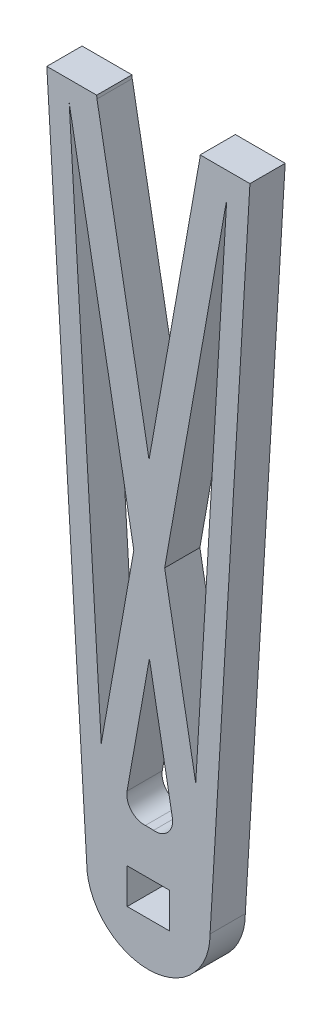
ISO-10303-21;
HEADER;
FILE_DESCRIPTION(('STEP AP214'),'2;1');
FILE_NAME('part.step','',(''),(''),'','','');
FILE_SCHEMA(('AUTOMOTIVE_DESIGN { 1 0 10303 214 1 1 1 1 }'));
ENDSEC;
DATA;
#1=APPLICATION_CONTEXT('core data for automotive mechanical design processes');
#2=APPLICATION_PROTOCOL_DEFINITION('international standard','automotive_design',2000,#1);
#3=PRODUCT_CONTEXT('',#1,'mechanical');
#4=PRODUCT('Part','Part','',(#3));
#5=PRODUCT_RELATED_PRODUCT_CATEGORY('part','',(#4));
#6=PRODUCT_DEFINITION_FORMATION('','',#4);
#7=PRODUCT_DEFINITION_CONTEXT('part definition',#1,'design');
#8=PRODUCT_DEFINITION('design','',#6,#7);
#9=PRODUCT_DEFINITION_SHAPE('','',#8);
#10=(LENGTH_UNIT() NAMED_UNIT(*) SI_UNIT(.MILLI.,.METRE.));
#11=(NAMED_UNIT(*) PLANE_ANGLE_UNIT() SI_UNIT($,.RADIAN.));
#12=(NAMED_UNIT(*) SI_UNIT($,.STERADIAN.) SOLID_ANGLE_UNIT());
#13=UNCERTAINTY_MEASURE_WITH_UNIT(LENGTH_MEASURE(1.E-05),#10,'distance_accuracy_value','');
#14=(GEOMETRIC_REPRESENTATION_CONTEXT(3) GLOBAL_UNCERTAINTY_ASSIGNED_CONTEXT((#13)) GLOBAL_UNIT_ASSIGNED_CONTEXT((#10,
#11,#12)) REPRESENTATION_CONTEXT('',''));
#15=CARTESIAN_POINT('',(0.,0.,0.));
#16=DIRECTION('',(0.,0.,1.));
#17=DIRECTION('',(1.,0.,0.));
#18=AXIS2_PLACEMENT_3D('',#15,#16,#17);
#19=CARTESIAN_POINT('',(0.,0.,10.));
#20=DIRECTION('',(0.,0.,1.));
#21=DIRECTION('',(1.,0.,0.));
#22=AXIS2_PLACEMENT_3D('',#19,#20,#21);
#23=PLANE('',#22);
#24=DIRECTION('',(1.,0.,0.));
#25=VECTOR('',#24,1.);
#26=CARTESIAN_POINT('',(28.8095238095238,-20.,10.));
#27=LINE('',#26,#25);
#28=CARTESIAN_POINT('',(-28.8095238095238,-20.,10.));
#29=VERTEX_POINT('',#28);
#30=CARTESIAN_POINT('',(-14.6611012369298,-20.,10.));
#31=VERTEX_POINT('',#30);
#32=EDGE_CURVE('E122',#29,#31,#27,.T.);
#33=ORIENTED_EDGE('',*,*,#32,.F.);
#34=DIRECTION('',(0.0594186399842153,-0.998233151734817,0.));
#35=VECTOR('',#34,1.);
#36=CARTESIAN_POINT('',(-29.8940827566728,-1.77940968789719,10.));
#37=LINE('',#36,#35);
#38=CARTESIAN_POINT('',(-17.5,-210.,10.));
#39=VERTEX_POINT('',#38);
#40=EDGE_CURVE('E282',#29,#39,#37,.T.);
#41=ORIENTED_EDGE('',*,*,#40,.T.);
#42=CARTESIAN_POINT('',(0.,-210.,10.));
#43=DIRECTION('',(0.,0.,1.));
#44=DIRECTION('',(1.,0.,0.));
#45=AXIS2_PLACEMENT_3D('',#42,#43,#44);
#46=CIRCLE('',#45,17.5);
#47=CARTESIAN_POINT('',(17.5,-210.,10.));
#48=VERTEX_POINT('',#47);
#49=EDGE_CURVE('E291',#39,#48,#46,.T.);
#50=ORIENTED_EDGE('',*,*,#49,.T.);
#51=DIRECTION('',(-0.0594186399842153,-0.998233151734817,0.));
#52=VECTOR('',#51,1.);
#53=CARTESIAN_POINT('',(29.8940827566728,-1.77940968789719,10.));
#54=LINE('',#53,#52);
#55=CARTESIAN_POINT('',(28.8095238095238,-20.,10.));
#56=VERTEX_POINT('',#55);
#57=EDGE_CURVE('E294',#56,#48,#54,.T.);
#58=ORIENTED_EDGE('',*,*,#57,.F.);
#59=DIRECTION('',(-1.,0.,0.));
#60=VECTOR('',#59,1.);
#61=CARTESIAN_POINT('',(0.,-20.,10.));
#62=LINE('',#61,#60);
#63=CARTESIAN_POINT('',(14.6791588769717,-20.,10.));
#64=VERTEX_POINT('',#63);
#65=EDGE_CURVE('E275',#56,#64,#62,.T.);
#66=ORIENTED_EDGE('',*,*,#65,.T.);
#67=CARTESIAN_POINT('',(9.67915887697167,-20.,10.));
#68=DIRECTION('',(0.,0.,1.));
#69=DIRECTION('',(1.,0.,0.));
#70=AXIS2_PLACEMENT_3D('',#67,#68,#69);
#71=CIRCLE('',#70,5.);
#72=CARTESIAN_POINT('',(14.6023785703389,-20.8728733303528,10.));
#73=VERTEX_POINT('',#72);
#74=EDGE_CURVE('E115',#64,#73,#71,.F.);
#75=ORIENTED_EDGE('',*,*,#74,.T.);
#76=DIRECTION('',(0.174574666070561,0.984643938673444,0.));
#77=VECTOR('',#76,1.);
#78=CARTESIAN_POINT('',(17.7452712206691,-3.14618785126878,10.));
#79=LINE('',#78,#77);
#80=CARTESIAN_POINT('',(0.190220551076297,-102.160979768059,10.));
#81=VERTEX_POINT('',#80);
#82=EDGE_CURVE('E369',#81,#73,#79,.T.);
#83=ORIENTED_EDGE('',*,*,#82,.F.);
#84=DIRECTION('',(-0.178826073356073,0.983880701857724,0.));
#85=VECTOR('',#84,1.);
#86=CARTESIAN_POINT('',(-17.7904251161172,-3.23351384049256,10.));
#87=LINE('',#86,#85);
#88=CARTESIAN_POINT('',(-14.5805047462184,-20.8941303667804,10.));
#89=VERTEX_POINT('',#88);
#90=EDGE_CURVE('E377',#81,#89,#87,.T.);
#91=ORIENTED_EDGE('',*,*,#90,.T.);
#92=CARTESIAN_POINT('',(-9.66110123692979,-20.,10.));
#93=DIRECTION('',(0.,0.,1.));
#94=DIRECTION('',(1.,0.,0.));
#95=AXIS2_PLACEMENT_3D('',#92,#93,#94);
#96=CIRCLE('',#95,5.);
#97=EDGE_CURVE('E285',#89,#31,#96,.F.);
#98=ORIENTED_EDGE('',*,*,#97,.T.);
#99=EDGE_LOOP('',(#33,#41,#50,#58,#66,#75,#83,#91,#98));
#100=FACE_BOUND('',#99,.T.);
#101=DIRECTION('',(0.,1.,0.));
#102=VECTOR('',#101,1.);
#103=CARTESIAN_POINT('',(-6.00000000000001,0.,10.));
#104=LINE('',#103,#102);
#105=CARTESIAN_POINT('',(-6.00000000000001,-215.,10.));
#106=VERTEX_POINT('',#105);
#107=CARTESIAN_POINT('',(-6.00000000000001,-205.,10.));
#108=VERTEX_POINT('',#107);
#109=EDGE_CURVE('E304',#106,#108,#104,.T.);
#110=ORIENTED_EDGE('',*,*,#109,.T.);
#111=DIRECTION('',(1.,0.,0.));
#112=VECTOR('',#111,1.);
#113=CARTESIAN_POINT('',(4.74157750100327E-13,-205.,10.));
#114=LINE('',#113,#112);
#115=CARTESIAN_POINT('',(6.,-205.,10.));
#116=VERTEX_POINT('',#115);
#117=EDGE_CURVE('E307',#108,#116,#114,.T.);
#118=ORIENTED_EDGE('',*,*,#117,.T.);
#119=DIRECTION('',(0.,1.,0.));
#120=VECTOR('',#119,1.);
#121=CARTESIAN_POINT('',(5.99999999999989,0.,10.));
#122=LINE('',#121,#120);
#123=CARTESIAN_POINT('',(6.00000000000001,-215.,10.));
#124=VERTEX_POINT('',#123);
#125=EDGE_CURVE('E309',#124,#116,#122,.T.);
#126=ORIENTED_EDGE('',*,*,#125,.F.);
#127=DIRECTION('',(1.,0.,0.));
#128=VECTOR('',#127,1.);
#129=CARTESIAN_POINT('',(-4.97287396446684E-13,-215.,10.));
#130=LINE('',#129,#128);
#131=EDGE_CURVE('E312',#106,#124,#130,.T.);
#132=ORIENTED_EDGE('',*,*,#131,.F.);
#133=EDGE_LOOP('',(#110,#118,#126,#132));
#134=FACE_BOUND('',#133,.T.);
#135=DIRECTION('',(-0.178826073356073,0.983880701857724,0.));
#136=VECTOR('',#135,1.);
#137=CARTESIAN_POINT('',(-26.2678721622271,-4.77433943497515,10.));
#138=LINE('',#137,#136);
#139=CARTESIAN_POINT('',(6.79531038371948,-186.684206595022,10.));
#140=VERTEX_POINT('',#139);
#141=CARTESIAN_POINT('',(0.29160959832128,-150.901585116392,10.));
#142=VERTEX_POINT('',#141);
#143=EDGE_CURVE('E719',#140,#142,#138,.T.);
#144=ORIENTED_EDGE('',*,*,#143,.F.);
#145=CARTESIAN_POINT('',(1.87590687443086,-187.578336961803,10.));
#146=DIRECTION('',(0.,0.,1.));
#147=DIRECTION('',(1.,0.,0.));
#148=AXIS2_PLACEMENT_3D('',#145,#146,#147);
#149=CIRCLE('',#148,5.);
#150=CARTESIAN_POINT('',(1.45903868011289,-192.560928748069,10.));
#151=VERTEX_POINT('',#150);
#152=EDGE_CURVE('E357',#140,#151,#149,.F.);
#153=ORIENTED_EDGE('',*,*,#152,.T.);
#154=CARTESIAN_POINT('',(0.,-210.,10.));
#155=DIRECTION('',(0.,0.,1.));
#156=DIRECTION('',(1.,0.,0.));
#157=AXIS2_PLACEMENT_3D('',#154,#155,#156);
#158=CIRCLE('',#157,17.5);
#159=CARTESIAN_POINT('',(-0.874372767581587,-192.521857299378,10.));
#160=VERTEX_POINT('',#159);
#161=EDGE_CURVE('E714',#151,#160,#158,.T.);
#162=ORIENTED_EDGE('',*,*,#161,.T.);
#163=CARTESIAN_POINT('',(-1.12419355831918,-187.528102242057,10.));
#164=DIRECTION('',(0.,0.,1.));
#165=DIRECTION('',(1.,0.,0.));
#166=AXIS2_PLACEMENT_3D('',#163,#164,#165);
#167=CIRCLE('',#166,5.);
#168=CARTESIAN_POINT('',(-6.0474132516864,-186.655228911704,10.));
#169=VERTEX_POINT('',#168);
#170=EDGE_CURVE('E361',#160,#169,#167,.F.);
#171=ORIENTED_EDGE('',*,*,#170,.T.);
#172=DIRECTION('',(0.174574666070561,0.984643938673444,0.));
#173=VECTOR('',#172,1.);
#174=CARTESIAN_POINT('',(26.2217824014059,-4.64905000346376,10.));
#175=LINE('',#174,#173);
#176=EDGE_CURVE('E727',#169,#142,#175,.T.);
#177=ORIENTED_EDGE('',*,*,#176,.T.);
#178=EDGE_LOOP('',(#144,#153,#162,#171,#177));
#179=FACE_BOUND('',#178,.T.);
#180=DIRECTION('',(-0.178826073356073,0.983880701857724,0.));
#181=VECTOR('',#180,1.);
#182=CARTESIAN_POINT('',(-17.7904251161172,-3.23351384049256,10.));
#183=LINE('',#182,#181);
#184=CARTESIAN_POINT('',(13.4301626709257,-175.005634358752,10.));
#185=VERTEX_POINT('',#184);
#186=CARTESIAN_POINT('',(4.61598635326493,-126.511039476885,10.));
#187=VERTEX_POINT('',#186);
#188=EDGE_CURVE('E420',#185,#187,#183,.T.);
#189=ORIENTED_EDGE('',*,*,#188,.T.);
#190=DIRECTION('',(0.174574666070561,0.984643938673444,0.));
#191=VECTOR('',#190,1.);
#192=CARTESIAN_POINT('',(26.2217824014059,-4.64905000346376,10.));
#193=LINE('',#192,#191);
#194=CARTESIAN_POINT('',(22.2304198411749,-27.1613138985647,10.));
#195=VERTEX_POINT('',#194);
#196=EDGE_CURVE('E417',#187,#195,#193,.T.);
#197=ORIENTED_EDGE('',*,*,#196,.T.);
#198=DIRECTION('',(-0.0594186399842153,-0.998233151734817,0.));
#199=VECTOR('',#198,1.);
#200=CARTESIAN_POINT('',(23.7629705178262,-1.41446253082299,10.));
#201=LINE('',#200,#199);
#202=EDGE_CURVE('E411',#195,#185,#201,.T.);
#203=ORIENTED_EDGE('',*,*,#202,.T.);
#204=EDGE_LOOP('',(#189,#197,#203));
#205=FACE_BOUND('',#204,.T.);
#206=DIRECTION('',(0.174574666070561,0.984643938673444,0.));
#207=VECTOR('',#206,1.);
#208=CARTESIAN_POINT('',(17.7452712206691,-3.14618785126878,10.));
#209=LINE('',#208,#207);
#210=CARTESIAN_POINT('',(-13.367328464566,-178.628881795291,10.));
#211=VERTEX_POINT('',#210);
#212=CARTESIAN_POINT('',(-4.13415620386734,-126.551525407566,10.));
#213=VERTEX_POINT('',#212);
#214=EDGE_CURVE('E745',#211,#213,#209,.T.);
#215=ORIENTED_EDGE('',*,*,#214,.F.);
#216=DIRECTION('',(-0.0594186399842153,0.998233151734817,0.));
#217=VECTOR('',#216,1.);
#218=CARTESIAN_POINT('',(-23.9152662053382,-1.42352775031775,10.));
#219=LINE('',#218,#217);
#220=CARTESIAN_POINT('',(-22.4730270714025,-25.6531452004381,10.));
#221=VERTEX_POINT('',#220);
#222=EDGE_CURVE('E429',#211,#221,#219,.T.);
#223=ORIENTED_EDGE('',*,*,#222,.T.);
#224=DIRECTION('',(-0.178826073356073,0.983880701857724,0.));
#225=VECTOR('',#224,1.);
#226=CARTESIAN_POINT('',(-26.2678721622271,-4.77433943497515,10.));
#227=LINE('',#226,#225);
#228=EDGE_CURVE('E402',#213,#221,#227,.T.);
#229=ORIENTED_EDGE('',*,*,#228,.F.);
#230=EDGE_LOOP('',(#215,#223,#229));
#231=FACE_BOUND('',#230,.T.);
#232=ADVANCED_FACE('F107',(#100,#134,#179,#205,#231),#23,.T.);
#233=CARTESIAN_POINT('',(0.,0.,0.));
#234=DIRECTION('',(0.,0.,1.));
#235=DIRECTION('',(1.,0.,0.));
#236=AXIS2_PLACEMENT_3D('',#233,#234,#235);
#237=PLANE('',#236);
#238=DIRECTION('',(-0.0594186399842153,0.998233151734817,0.));
#239=VECTOR('',#238,1.);
#240=CARTESIAN_POINT('',(-23.9152662053382,-1.42352775031775,0.));
#241=LINE('',#240,#239);
#242=CARTESIAN_POINT('',(-13.367328464566,-178.628881795291,0.));
#243=VERTEX_POINT('',#242);
#244=CARTESIAN_POINT('',(-22.4730270714025,-25.6531452004381,0.));
#245=VERTEX_POINT('',#244);
#246=EDGE_CURVE('E737',#243,#245,#241,.T.);
#247=ORIENTED_EDGE('',*,*,#246,.F.);
#248=DIRECTION('',(0.174574666070561,0.984643938673444,0.));
#249=VECTOR('',#248,1.);
#250=CARTESIAN_POINT('',(17.7452712206691,-3.14618785126878,0.));
#251=LINE('',#250,#249);
#252=CARTESIAN_POINT('',(-4.13415620386734,-126.551525407566,0.));
#253=VERTEX_POINT('',#252);
#254=EDGE_CURVE('E739',#243,#253,#251,.T.);
#255=ORIENTED_EDGE('',*,*,#254,.T.);
#256=DIRECTION('',(-0.178826073356073,0.983880701857724,0.));
#257=VECTOR('',#256,1.);
#258=CARTESIAN_POINT('',(-26.2678721622271,-4.77433943497515,0.));
#259=LINE('',#258,#257);
#260=EDGE_CURVE('E407',#253,#245,#259,.T.);
#261=ORIENTED_EDGE('',*,*,#260,.T.);
#262=EDGE_LOOP('',(#247,#255,#261));
#263=FACE_BOUND('',#262,.T.);
#264=CARTESIAN_POINT('',(0.,-210.,0.));
#265=DIRECTION('',(0.,0.,1.));
#266=DIRECTION('',(1.,0.,0.));
#267=AXIS2_PLACEMENT_3D('',#264,#265,#266);
#268=CIRCLE('',#267,17.5);
#269=CARTESIAN_POINT('',(1.45903868011289,-192.560928748069,0.));
#270=VERTEX_POINT('',#269);
#271=CARTESIAN_POINT('',(-0.874372767581587,-192.521857299378,0.));
#272=VERTEX_POINT('',#271);
#273=EDGE_CURVE('E723',#270,#272,#268,.T.);
#274=ORIENTED_EDGE('',*,*,#273,.F.);
#275=CARTESIAN_POINT('',(1.87590687443086,-187.578336961803,0.));
#276=DIRECTION('',(0.,0.,1.));
#277=DIRECTION('',(1.,0.,0.));
#278=AXIS2_PLACEMENT_3D('',#275,#276,#277);
#279=CIRCLE('',#278,5.);
#280=CARTESIAN_POINT('',(6.79531038371948,-186.684206595022,0.));
#281=VERTEX_POINT('',#280);
#282=EDGE_CURVE('E359',#270,#281,#279,.T.);
#283=ORIENTED_EDGE('',*,*,#282,.T.);
#284=DIRECTION('',(-0.178826073356073,0.983880701857724,0.));
#285=VECTOR('',#284,1.);
#286=CARTESIAN_POINT('',(-26.2678721622271,-4.77433943497515,0.));
#287=LINE('',#286,#285);
#288=CARTESIAN_POINT('',(0.291609598321283,-150.901585116392,0.));
#289=VERTEX_POINT('',#288);
#290=EDGE_CURVE('E726',#281,#289,#287,.T.);
#291=ORIENTED_EDGE('',*,*,#290,.T.);
#292=DIRECTION('',(0.174574666070561,0.984643938673444,0.));
#293=VECTOR('',#292,1.);
#294=CARTESIAN_POINT('',(26.2217824014059,-4.64905000346376,0.));
#295=LINE('',#294,#293);
#296=CARTESIAN_POINT('',(-6.0474132516864,-186.655228911704,0.));
#297=VERTEX_POINT('',#296);
#298=EDGE_CURVE('E730',#297,#289,#295,.T.);
#299=ORIENTED_EDGE('',*,*,#298,.F.);
#300=CARTESIAN_POINT('',(-1.12419355831918,-187.528102242057,0.));
#301=DIRECTION('',(0.,0.,1.));
#302=DIRECTION('',(1.,0.,0.));
#303=AXIS2_PLACEMENT_3D('',#300,#301,#302);
#304=CIRCLE('',#303,5.);
#305=EDGE_CURVE('E363',#297,#272,#304,.T.);
#306=ORIENTED_EDGE('',*,*,#305,.T.);
#307=EDGE_LOOP('',(#274,#283,#291,#299,#306));
#308=FACE_BOUND('',#307,.T.);
#309=DIRECTION('',(0.,1.,0.));
#310=VECTOR('',#309,1.);
#311=CARTESIAN_POINT('',(-6.00000000000001,0.,0.));
#312=LINE('',#311,#310);
#313=CARTESIAN_POINT('',(-6.00000000000001,-215.,0.));
#314=VERTEX_POINT('',#313);
#315=CARTESIAN_POINT('',(-6.00000000000001,-205.,0.));
#316=VERTEX_POINT('',#315);
#317=EDGE_CURVE('E323',#314,#316,#312,.T.);
#318=ORIENTED_EDGE('',*,*,#317,.F.);
#319=DIRECTION('',(1.,0.,0.));
#320=VECTOR('',#319,1.);
#321=CARTESIAN_POINT('',(-4.97287396446684E-13,-215.,0.));
#322=LINE('',#321,#320);
#323=CARTESIAN_POINT('',(6.00000000000001,-215.,0.));
#324=VERTEX_POINT('',#323);
#325=EDGE_CURVE('E292',#314,#324,#322,.T.);
#326=ORIENTED_EDGE('',*,*,#325,.T.);
#327=DIRECTION('',(0.,1.,0.));
#328=VECTOR('',#327,1.);
#329=CARTESIAN_POINT('',(5.99999999999989,0.,0.));
#330=LINE('',#329,#328);
#331=CARTESIAN_POINT('',(6.,-205.,0.));
#332=VERTEX_POINT('',#331);
#333=EDGE_CURVE('E297',#324,#332,#330,.T.);
#334=ORIENTED_EDGE('',*,*,#333,.T.);
#335=DIRECTION('',(1.,0.,0.));
#336=VECTOR('',#335,1.);
#337=CARTESIAN_POINT('',(4.74157750100327E-13,-205.,0.));
#338=LINE('',#337,#336);
#339=EDGE_CURVE('E326',#316,#332,#338,.T.);
#340=ORIENTED_EDGE('',*,*,#339,.F.);
#341=EDGE_LOOP('',(#318,#326,#334,#340));
#342=FACE_BOUND('',#341,.T.);
#343=DIRECTION('',(0.0594186399842153,-0.998233151734817,0.));
#344=VECTOR('',#343,1.);
#345=CARTESIAN_POINT('',(-29.8940827566728,-1.77940968789719,0.));
#346=LINE('',#345,#344);
#347=CARTESIAN_POINT('',(-28.8095238095238,-20.,0.));
#348=VERTEX_POINT('',#347);
#349=CARTESIAN_POINT('',(-17.5,-210.,0.));
#350=VERTEX_POINT('',#349);
#351=EDGE_CURVE('E316',#348,#350,#346,.T.);
#352=ORIENTED_EDGE('',*,*,#351,.F.);
#353=DIRECTION('',(1.,0.,0.));
#354=VECTOR('',#353,1.);
#355=CARTESIAN_POINT('',(28.8095238095238,-20.,0.));
#356=LINE('',#355,#354);
#357=CARTESIAN_POINT('',(-14.6611012369298,-20.,0.));
#358=VERTEX_POINT('',#357);
#359=EDGE_CURVE('E271',#348,#358,#356,.T.);
#360=ORIENTED_EDGE('',*,*,#359,.T.);
#361=CARTESIAN_POINT('',(-9.66110123692979,-20.,0.));
#362=DIRECTION('',(0.,0.,1.));
#363=DIRECTION('',(1.,0.,0.));
#364=AXIS2_PLACEMENT_3D('',#361,#362,#363);
#365=CIRCLE('',#364,5.);
#366=CARTESIAN_POINT('',(-14.5805047462184,-20.8941303667804,0.));
#367=VERTEX_POINT('',#366);
#368=EDGE_CURVE('E366',#358,#367,#365,.T.);
#369=ORIENTED_EDGE('',*,*,#368,.T.);
#370=DIRECTION('',(-0.178826073356073,0.983880701857724,0.));
#371=VECTOR('',#370,1.);
#372=CARTESIAN_POINT('',(-17.7904251161172,-3.23351384049256,0.));
#373=LINE('',#372,#371);
#374=CARTESIAN_POINT('',(0.190220551076304,-102.160979768059,0.));
#375=VERTEX_POINT('',#374);
#376=EDGE_CURVE('E376',#375,#367,#373,.T.);
#377=ORIENTED_EDGE('',*,*,#376,.F.);
#378=DIRECTION('',(0.174574666070561,0.984643938673444,0.));
#379=VECTOR('',#378,1.);
#380=CARTESIAN_POINT('',(17.7452712206691,-3.14618785126878,0.));
#381=LINE('',#380,#379);
#382=CARTESIAN_POINT('',(14.6023785703389,-20.8728733303528,0.));
#383=VERTEX_POINT('',#382);
#384=EDGE_CURVE('E387',#375,#383,#381,.T.);
#385=ORIENTED_EDGE('',*,*,#384,.T.);
#386=CARTESIAN_POINT('',(9.67915887697167,-20.,0.));
#387=DIRECTION('',(0.,0.,1.));
#388=DIRECTION('',(1.,0.,0.));
#389=AXIS2_PLACEMENT_3D('',#386,#387,#388);
#390=CIRCLE('',#389,5.);
#391=CARTESIAN_POINT('',(14.6791588769717,-20.,0.));
#392=VERTEX_POINT('',#391);
#393=EDGE_CURVE('E12',#383,#392,#390,.T.);
#394=ORIENTED_EDGE('',*,*,#393,.T.);
#395=DIRECTION('',(-1.,0.,0.));
#396=VECTOR('',#395,1.);
#397=CARTESIAN_POINT('',(0.,-20.,0.));
#398=LINE('',#397,#396);
#399=CARTESIAN_POINT('',(28.8095238095238,-20.,0.));
#400=VERTEX_POINT('',#399);
#401=EDGE_CURVE('E384',#400,#392,#398,.T.);
#402=ORIENTED_EDGE('',*,*,#401,.F.);
#403=DIRECTION('',(-0.0594186399842153,-0.998233151734817,0.));
#404=VECTOR('',#403,1.);
#405=CARTESIAN_POINT('',(29.8940827566728,-1.77940968789719,0.));
#406=LINE('',#405,#404);
#407=CARTESIAN_POINT('',(17.5,-210.,0.));
#408=VERTEX_POINT('',#407);
#409=EDGE_CURVE('E321',#400,#408,#406,.T.);
#410=ORIENTED_EDGE('',*,*,#409,.T.);
#411=CARTESIAN_POINT('',(0.,-210.,0.));
#412=DIRECTION('',(0.,0.,1.));
#413=DIRECTION('',(1.,0.,0.));
#414=AXIS2_PLACEMENT_3D('',#411,#412,#413);
#415=CIRCLE('',#414,17.5);
#416=EDGE_CURVE('E318',#350,#408,#415,.T.);
#417=ORIENTED_EDGE('',*,*,#416,.F.);
#418=EDGE_LOOP('',(#352,#360,#369,#377,#385,#394,#402,#410,#417));
#419=FACE_BOUND('',#418,.T.);
#420=DIRECTION('',(0.174574666070561,0.984643938673444,0.));
#421=VECTOR('',#420,1.);
#422=CARTESIAN_POINT('',(26.2217824014059,-4.64905000346376,0.));
#423=LINE('',#422,#421);
#424=CARTESIAN_POINT('',(4.61598635326493,-126.511039476885,0.));
#425=VERTEX_POINT('',#424);
#426=CARTESIAN_POINT('',(22.2304198411749,-27.1613138985647,0.));
#427=VERTEX_POINT('',#426);
#428=EDGE_CURVE('E408',#425,#427,#423,.T.);
#429=ORIENTED_EDGE('',*,*,#428,.F.);
#430=DIRECTION('',(-0.178826073356073,0.983880701857724,0.));
#431=VECTOR('',#430,1.);
#432=CARTESIAN_POINT('',(-17.7904251161172,-3.23351384049256,0.));
#433=LINE('',#432,#431);
#434=CARTESIAN_POINT('',(13.4301626709257,-175.005634358752,0.));
#435=VERTEX_POINT('',#434);
#436=EDGE_CURVE('E410',#435,#425,#433,.T.);
#437=ORIENTED_EDGE('',*,*,#436,.F.);
#438=DIRECTION('',(-0.0594186399842153,-0.998233151734817,0.));
#439=VECTOR('',#438,1.);
#440=CARTESIAN_POINT('',(23.7629705178262,-1.41446253082299,0.));
#441=LINE('',#440,#439);
#442=EDGE_CURVE('E413',#427,#435,#441,.T.);
#443=ORIENTED_EDGE('',*,*,#442,.F.);
#444=EDGE_LOOP('',(#429,#437,#443));
#445=FACE_BOUND('',#444,.T.);
#446=ADVANCED_FACE('F382',(#263,#308,#342,#419,#445),#237,.F.);
#447=CARTESIAN_POINT('',(29.8940827566728,-1.77940968789719,10.));
#448=DIRECTION('',(0.998233151734817,-0.0594186399842152,0.));
#449=DIRECTION('',(0.0594186399842152,0.998233151734817,0.));
#450=AXIS2_PLACEMENT_3D('',#447,#448,#449);
#451=PLANE('',#450);
#452=ORIENTED_EDGE('',*,*,#409,.F.);
#453=DIRECTION('',(0.,0.,1.));
#454=VECTOR('',#453,1.);
#455=CARTESIAN_POINT('',(28.8095238095238,-20.,0.));
#456=LINE('',#455,#454);
#457=EDGE_CURVE('E712',#400,#56,#456,.T.);
#458=ORIENTED_EDGE('',*,*,#457,.T.);
#459=ORIENTED_EDGE('',*,*,#57,.T.);
#460=DIRECTION('',(0.,0.,-1.));
#461=VECTOR('',#460,1.);
#462=CARTESIAN_POINT('',(17.5,-210.,10.));
#463=LINE('',#462,#461);
#464=EDGE_CURVE('E315',#48,#408,#463,.T.);
#465=ORIENTED_EDGE('',*,*,#464,.T.);
#466=EDGE_LOOP('',(#452,#458,#459,#465));
#467=FACE_BOUND('',#466,.T.);
#468=ADVANCED_FACE('F447',(#467),#451,.T.);
#469=CARTESIAN_POINT('',(-6.00000000000001,0.,10.));
#470=DIRECTION('',(-1.,0.,0.));
#471=DIRECTION('',(0.,0.,1.));
#472=AXIS2_PLACEMENT_3D('',#469,#470,#471);
#473=PLANE('',#472);
#474=ORIENTED_EDGE('',*,*,#317,.T.);
#475=DIRECTION('',(0.,0.,-1.));
#476=VECTOR('',#475,1.);
#477=CARTESIAN_POINT('',(-6.00000000000001,-205.,10.));
#478=LINE('',#477,#476);
#479=EDGE_CURVE('E337',#108,#316,#478,.T.);
#480=ORIENTED_EDGE('',*,*,#479,.F.);
#481=ORIENTED_EDGE('',*,*,#109,.F.);
#482=DIRECTION('',(0.,0.,-1.));
#483=VECTOR('',#482,1.);
#484=CARTESIAN_POINT('',(-6.00000000000001,-215.,10.));
#485=LINE('',#484,#483);
#486=EDGE_CURVE('E331',#106,#314,#485,.T.);
#487=ORIENTED_EDGE('',*,*,#486,.T.);
#488=EDGE_LOOP('',(#474,#480,#481,#487));
#489=FACE_BOUND('',#488,.T.);
#490=ADVANCED_FACE('F455',(#489),#473,.F.);
#491=CARTESIAN_POINT('',(4.74157750100327E-13,-205.,10.));
#492=DIRECTION('',(0.,1.,0.));
#493=DIRECTION('',(-1.,0.,0.));
#494=AXIS2_PLACEMENT_3D('',#491,#492,#493);
#495=PLANE('',#494);
#496=ORIENTED_EDGE('',*,*,#339,.T.);
#497=DIRECTION('',(0.,0.,-1.));
#498=VECTOR('',#497,1.);
#499=CARTESIAN_POINT('',(6.,-205.,10.));
#500=LINE('',#499,#498);
#501=EDGE_CURVE('E335',#116,#332,#500,.T.);
#502=ORIENTED_EDGE('',*,*,#501,.F.);
#503=ORIENTED_EDGE('',*,*,#117,.F.);
#504=ORIENTED_EDGE('',*,*,#479,.T.);
#505=EDGE_LOOP('',(#496,#502,#503,#504));
#506=FACE_BOUND('',#505,.T.);
#507=ADVANCED_FACE('F472',(#506),#495,.F.);
#508=CARTESIAN_POINT('',(5.99999999999989,0.,10.));
#509=DIRECTION('',(-1.,0.,0.));
#510=DIRECTION('',(0.,-1.,0.));
#511=AXIS2_PLACEMENT_3D('',#508,#509,#510);
#512=PLANE('',#511);
#513=ORIENTED_EDGE('',*,*,#333,.F.);
#514=DIRECTION('',(0.,0.,-1.));
#515=VECTOR('',#514,1.);
#516=CARTESIAN_POINT('',(6.00000000000001,-215.,10.));
#517=LINE('',#516,#515);
#518=EDGE_CURVE('E333',#124,#324,#517,.T.);
#519=ORIENTED_EDGE('',*,*,#518,.F.);
#520=ORIENTED_EDGE('',*,*,#125,.T.);
#521=ORIENTED_EDGE('',*,*,#501,.T.);
#522=EDGE_LOOP('',(#513,#519,#520,#521));
#523=FACE_BOUND('',#522,.T.);
#524=ADVANCED_FACE('F469',(#523),#512,.T.);
#525=CARTESIAN_POINT('',(-29.8940827566728,-1.77940968789719,10.));
#526=DIRECTION('',(0.998233151734817,0.0594186399842152,0.));
#527=DIRECTION('',(-0.0594186399842152,0.998233151734817,0.));
#528=AXIS2_PLACEMENT_3D('',#525,#526,#527);
#529=PLANE('',#528);
#530=ORIENTED_EDGE('',*,*,#40,.F.);
#531=DIRECTION('',(0.,0.,-1.));
#532=VECTOR('',#531,1.);
#533=CARTESIAN_POINT('',(-28.8095238095238,-20.,10.));
#534=LINE('',#533,#532);
#535=EDGE_CURVE('E268',#29,#348,#534,.T.);
#536=ORIENTED_EDGE('',*,*,#535,.T.);
#537=ORIENTED_EDGE('',*,*,#351,.T.);
#538=DIRECTION('',(0.,0.,-1.));
#539=VECTOR('',#538,1.);
#540=CARTESIAN_POINT('',(-17.5,-210.,10.));
#541=LINE('',#540,#539);
#542=EDGE_CURVE('E290',#39,#350,#541,.T.);
#543=ORIENTED_EDGE('',*,*,#542,.F.);
#544=EDGE_LOOP('',(#530,#536,#537,#543));
#545=FACE_BOUND('',#544,.T.);
#546=ADVANCED_FACE('F288',(#545),#529,.F.);
#547=CARTESIAN_POINT('',(0.,-210.,10.));
#548=DIRECTION('',(0.,0.,-1.));
#549=DIRECTION('',(-1.,0.,0.));
#550=AXIS2_PLACEMENT_3D('',#547,#548,#549);
#551=CYLINDRICAL_SURFACE('',#550,17.5);
#552=ORIENTED_EDGE('',*,*,#416,.T.);
#553=ORIENTED_EDGE('',*,*,#464,.F.);
#554=ORIENTED_EDGE('',*,*,#49,.F.);
#555=ORIENTED_EDGE('',*,*,#542,.T.);
#556=EDGE_LOOP('',(#552,#553,#554,#555));
#557=FACE_BOUND('',#556,.T.);
#558=ADVANCED_FACE('F467',(#557),#551,.T.);
#559=CARTESIAN_POINT('',(-4.97287396446684E-13,-215.,10.));
#560=DIRECTION('',(0.,1.,0.));
#561=DIRECTION('',(-1.,0.,0.));
#562=AXIS2_PLACEMENT_3D('',#559,#560,#561);
#563=PLANE('',#562);
#564=ORIENTED_EDGE('',*,*,#325,.F.);
#565=ORIENTED_EDGE('',*,*,#486,.F.);
#566=ORIENTED_EDGE('',*,*,#131,.T.);
#567=ORIENTED_EDGE('',*,*,#518,.T.);
#568=EDGE_LOOP('',(#564,#565,#566,#567));
#569=FACE_BOUND('',#568,.T.);
#570=ADVANCED_FACE('F463',(#569),#563,.T.);
#571=CARTESIAN_POINT('',(-17.7904251161172,-3.23351384049256,0.));
#572=DIRECTION('',(0.983880701857725,0.178826073356073,0.));
#573=DIRECTION('',(-0.178826073356073,0.983880701857725,0.));
#574=AXIS2_PLACEMENT_3D('',#571,#572,#573);
#575=PLANE('',#574);
#576=ORIENTED_EDGE('',*,*,#376,.T.);
#577=DIRECTION('',(0.,0.,1.));
#578=VECTOR('',#577,1.);
#579=CARTESIAN_POINT('',(-14.5805047462184,-20.8941303667804,10.));
#580=LINE('',#579,#578);
#581=EDGE_CURVE('E353',#367,#89,#580,.T.);
#582=ORIENTED_EDGE('',*,*,#581,.T.);
#583=ORIENTED_EDGE('',*,*,#90,.F.);
#584=DIRECTION('',(0.,0.,1.));
#585=VECTOR('',#584,1.);
#586=CARTESIAN_POINT('',(0.190220551076304,-102.160979768059,0.));
#587=LINE('',#586,#585);
#588=EDGE_CURVE('E300',#375,#81,#587,.T.);
#589=ORIENTED_EDGE('',*,*,#588,.F.);
#590=EDGE_LOOP('',(#576,#582,#583,#589));
#591=FACE_BOUND('',#590,.T.);
#592=ADVANCED_FACE('F466',(#591),#575,.T.);
#593=CARTESIAN_POINT('',(17.7452712206691,-3.14618785126878,0.));
#594=DIRECTION('',(0.984643938673444,-0.174574666070561,0.));
#595=DIRECTION('',(0.174574666070561,0.984643938673444,0.));
#596=AXIS2_PLACEMENT_3D('',#593,#594,#595);
#597=PLANE('',#596);
#598=ORIENTED_EDGE('',*,*,#82,.T.);
#599=DIRECTION('',(0.,0.,1.));
#600=VECTOR('',#599,1.);
#601=CARTESIAN_POINT('',(14.6023785703389,-20.8728733303528,0.));
#602=LINE('',#601,#600);
#603=EDGE_CURVE('E130',#73,#383,#602,.F.);
#604=ORIENTED_EDGE('',*,*,#603,.T.);
#605=ORIENTED_EDGE('',*,*,#384,.F.);
#606=ORIENTED_EDGE('',*,*,#588,.T.);
#607=EDGE_LOOP('',(#598,#604,#605,#606));
#608=FACE_BOUND('',#607,.T.);
#609=ADVANCED_FACE('F375',(#608),#597,.F.);
#610=CARTESIAN_POINT('',(0.,-210.,0.));
#611=DIRECTION('',(0.,0.,1.));
#612=DIRECTION('',(1.,0.,0.));
#613=AXIS2_PLACEMENT_3D('',#610,#611,#612);
#614=CYLINDRICAL_SURFACE('',#613,17.5);
#615=ORIENTED_EDGE('',*,*,#161,.F.);
#616=DIRECTION('',(0.,0.,1.));
#617=VECTOR('',#616,1.);
#618=CARTESIAN_POINT('',(1.45903868011289,-192.560928748069,0.));
#619=LINE('',#618,#617);
#620=EDGE_CURVE('E349',#151,#270,#619,.F.);
#621=ORIENTED_EDGE('',*,*,#620,.T.);
#622=ORIENTED_EDGE('',*,*,#273,.T.);
#623=DIRECTION('',(0.,0.,1.));
#624=VECTOR('',#623,1.);
#625=CARTESIAN_POINT('',(-0.874372767581587,-192.521857299378,0.));
#626=LINE('',#625,#624);
#627=EDGE_CURVE('E346',#272,#160,#626,.T.);
#628=ORIENTED_EDGE('',*,*,#627,.T.);
#629=EDGE_LOOP('',(#615,#621,#622,#628));
#630=FACE_BOUND('',#629,.T.);
#631=ADVANCED_FACE('F507',(#630),#614,.T.);
#632=CARTESIAN_POINT('',(26.2217824014059,-4.64905000346376,0.));
#633=DIRECTION('',(0.984643938673444,-0.174574666070561,0.));
#634=DIRECTION('',(0.174574666070561,0.984643938673444,0.));
#635=AXIS2_PLACEMENT_3D('',#632,#633,#634);
#636=PLANE('',#635);
#637=ORIENTED_EDGE('',*,*,#176,.F.);
#638=DIRECTION('',(0.,0.,-1.));
#639=VECTOR('',#638,1.);
#640=CARTESIAN_POINT('',(-6.0474132516864,-186.655228911704,0.));
#641=LINE('',#640,#639);
#642=EDGE_CURVE('E351',#169,#297,#641,.T.);
#643=ORIENTED_EDGE('',*,*,#642,.T.);
#644=ORIENTED_EDGE('',*,*,#298,.T.);
#645=DIRECTION('',(0.,0.,1.));
#646=VECTOR('',#645,1.);
#647=CARTESIAN_POINT('',(0.29160959832128,-150.901585116392,0.));
#648=LINE('',#647,#646);
#649=EDGE_CURVE('E421',#289,#142,#648,.T.);
#650=ORIENTED_EDGE('',*,*,#649,.T.);
#651=EDGE_LOOP('',(#637,#643,#644,#650));
#652=FACE_BOUND('',#651,.T.);
#653=ADVANCED_FACE('F529',(#652),#636,.T.);
#654=CARTESIAN_POINT('',(-26.2678721622271,-4.77433943497515,0.));
#655=DIRECTION('',(0.983880701857725,0.178826073356073,0.));
#656=DIRECTION('',(-0.178826073356073,0.983880701857725,0.));
#657=AXIS2_PLACEMENT_3D('',#654,#655,#656);
#658=PLANE('',#657);
#659=ORIENTED_EDGE('',*,*,#290,.F.);
#660=DIRECTION('',(0.,0.,1.));
#661=VECTOR('',#660,1.);
#662=CARTESIAN_POINT('',(6.79531038371948,-186.684206595022,0.));
#663=LINE('',#662,#661);
#664=EDGE_CURVE('E340',#281,#140,#663,.T.);
#665=ORIENTED_EDGE('',*,*,#664,.T.);
#666=ORIENTED_EDGE('',*,*,#143,.T.);
#667=ORIENTED_EDGE('',*,*,#649,.F.);
#668=EDGE_LOOP('',(#659,#665,#666,#667));
#669=FACE_BOUND('',#668,.T.);
#670=ADVANCED_FACE('F512',(#669),#658,.F.);
#671=CARTESIAN_POINT('',(26.2217824014059,-4.64905000346376,0.));
#672=DIRECTION('',(0.984643938673444,-0.174574666070561,0.));
#673=DIRECTION('',(0.174574666070561,0.984643938673444,0.));
#674=AXIS2_PLACEMENT_3D('',#671,#672,#673);
#675=PLANE('',#674);
#676=ORIENTED_EDGE('',*,*,#196,.F.);
#677=DIRECTION('',(0.,0.,1.));
#678=VECTOR('',#677,1.);
#679=CARTESIAN_POINT('',(4.61598635326493,-126.511039476885,0.));
#680=LINE('',#679,#678);
#681=EDGE_CURVE('E416',#425,#187,#680,.T.);
#682=ORIENTED_EDGE('',*,*,#681,.F.);
#683=ORIENTED_EDGE('',*,*,#428,.T.);
#684=DIRECTION('',(0.,0.,1.));
#685=VECTOR('',#684,1.);
#686=CARTESIAN_POINT('',(22.2304198411749,-27.1613138985647,0.));
#687=LINE('',#686,#685);
#688=EDGE_CURVE('E426',#427,#195,#687,.T.);
#689=ORIENTED_EDGE('',*,*,#688,.T.);
#690=EDGE_LOOP('',(#676,#682,#683,#689));
#691=FACE_BOUND('',#690,.T.);
#692=ADVANCED_FACE('F445',(#691),#675,.T.);
#693=CARTESIAN_POINT('',(23.7629705178262,-1.41446253082299,0.));
#694=DIRECTION('',(-0.998233151734817,0.0594186399842153,0.));
#695=DIRECTION('',(-0.0594186399842153,-0.998233151734817,0.));
#696=AXIS2_PLACEMENT_3D('',#693,#694,#695);
#697=PLANE('',#696);
#698=ORIENTED_EDGE('',*,*,#202,.F.);
#699=ORIENTED_EDGE('',*,*,#688,.F.);
#700=ORIENTED_EDGE('',*,*,#442,.T.);
#701=DIRECTION('',(0.,0.,1.));
#702=VECTOR('',#701,1.);
#703=CARTESIAN_POINT('',(13.4301626709257,-175.005634358752,0.));
#704=LINE('',#703,#702);
#705=EDGE_CURVE('E430',#435,#185,#704,.T.);
#706=ORIENTED_EDGE('',*,*,#705,.T.);
#707=EDGE_LOOP('',(#698,#699,#700,#706));
#708=FACE_BOUND('',#707,.T.);
#709=ADVANCED_FACE('F443',(#708),#697,.T.);
#710=CARTESIAN_POINT('',(-17.7904251161172,-3.23351384049256,0.));
#711=DIRECTION('',(0.983880701857725,0.178826073356073,0.));
#712=DIRECTION('',(-0.178826073356073,0.983880701857725,0.));
#713=AXIS2_PLACEMENT_3D('',#710,#711,#712);
#714=PLANE('',#713);
#715=ORIENTED_EDGE('',*,*,#188,.F.);
#716=ORIENTED_EDGE('',*,*,#705,.F.);
#717=ORIENTED_EDGE('',*,*,#436,.T.);
#718=ORIENTED_EDGE('',*,*,#681,.T.);
#719=EDGE_LOOP('',(#715,#716,#717,#718));
#720=FACE_BOUND('',#719,.T.);
#721=ADVANCED_FACE('F435',(#720),#714,.T.);
#722=CARTESIAN_POINT('',(-23.9152662053382,-1.42352775031775,0.));
#723=DIRECTION('',(0.998233151734817,0.0594186399842153,0.));
#724=DIRECTION('',(-0.0594186399842153,0.998233151734817,0.));
#725=AXIS2_PLACEMENT_3D('',#722,#723,#724);
#726=PLANE('',#725);
#727=ORIENTED_EDGE('',*,*,#222,.F.);
#728=DIRECTION('',(0.,0.,1.));
#729=VECTOR('',#728,1.);
#730=CARTESIAN_POINT('',(-13.367328464566,-178.628881795291,0.));
#731=LINE('',#730,#729);
#732=EDGE_CURVE('E399',#243,#211,#731,.T.);
#733=ORIENTED_EDGE('',*,*,#732,.F.);
#734=ORIENTED_EDGE('',*,*,#246,.T.);
#735=DIRECTION('',(0.,0.,1.));
#736=VECTOR('',#735,1.);
#737=CARTESIAN_POINT('',(-22.4730270714025,-25.6531452004381,0.));
#738=LINE('',#737,#736);
#739=EDGE_CURVE('E393',#245,#221,#738,.T.);
#740=ORIENTED_EDGE('',*,*,#739,.T.);
#741=EDGE_LOOP('',(#727,#733,#734,#740));
#742=FACE_BOUND('',#741,.T.);
#743=ADVANCED_FACE('F515',(#742),#726,.T.);
#744=CARTESIAN_POINT('',(-26.2678721622271,-4.77433943497515,0.));
#745=DIRECTION('',(0.983880701857725,0.178826073356073,0.));
#746=DIRECTION('',(-0.178826073356073,0.983880701857725,0.));
#747=AXIS2_PLACEMENT_3D('',#744,#745,#746);
#748=PLANE('',#747);
#749=ORIENTED_EDGE('',*,*,#228,.T.);
#750=ORIENTED_EDGE('',*,*,#739,.F.);
#751=ORIENTED_EDGE('',*,*,#260,.F.);
#752=DIRECTION('',(0.,0.,1.));
#753=VECTOR('',#752,1.);
#754=CARTESIAN_POINT('',(-4.13415620386734,-126.551525407566,0.));
#755=LINE('',#754,#753);
#756=EDGE_CURVE('E394',#253,#213,#755,.T.);
#757=ORIENTED_EDGE('',*,*,#756,.T.);
#758=EDGE_LOOP('',(#749,#750,#751,#757));
#759=FACE_BOUND('',#758,.T.);
#760=ADVANCED_FACE('F520',(#759),#748,.F.);
#761=CARTESIAN_POINT('',(17.7452712206691,-3.14618785126878,0.));
#762=DIRECTION('',(0.984643938673444,-0.174574666070561,0.));
#763=DIRECTION('',(0.174574666070561,0.984643938673444,0.));
#764=AXIS2_PLACEMENT_3D('',#761,#762,#763);
#765=PLANE('',#764);
#766=ORIENTED_EDGE('',*,*,#214,.T.);
#767=ORIENTED_EDGE('',*,*,#756,.F.);
#768=ORIENTED_EDGE('',*,*,#254,.F.);
#769=ORIENTED_EDGE('',*,*,#732,.T.);
#770=EDGE_LOOP('',(#766,#767,#768,#769));
#771=FACE_BOUND('',#770,.T.);
#772=ADVANCED_FACE('F488',(#771),#765,.F.);
#773=CARTESIAN_POINT('',(1.87590687443086,-187.578336961803,0.));
#774=DIRECTION('',(0.,0.,1.));
#775=DIRECTION('',(1.,0.,0.));
#776=AXIS2_PLACEMENT_3D('',#773,#774,#775);
#777=CYLINDRICAL_SURFACE('',#776,5.);
#778=ORIENTED_EDGE('',*,*,#282,.F.);
#779=ORIENTED_EDGE('',*,*,#620,.F.);
#780=ORIENTED_EDGE('',*,*,#152,.F.);
#781=ORIENTED_EDGE('',*,*,#664,.F.);
#782=EDGE_LOOP('',(#778,#779,#780,#781));
#783=FACE_BOUND('',#782,.T.);
#784=ADVANCED_FACE('F484',(#783),#777,.F.);
#785=CARTESIAN_POINT('',(-1.12419355831918,-187.528102242057,0.));
#786=DIRECTION('',(0.,0.,1.));
#787=DIRECTION('',(1.,0.,0.));
#788=AXIS2_PLACEMENT_3D('',#785,#786,#787);
#789=CYLINDRICAL_SURFACE('',#788,5.);
#790=ORIENTED_EDGE('',*,*,#305,.F.);
#791=ORIENTED_EDGE('',*,*,#642,.F.);
#792=ORIENTED_EDGE('',*,*,#170,.F.);
#793=ORIENTED_EDGE('',*,*,#627,.F.);
#794=EDGE_LOOP('',(#790,#791,#792,#793));
#795=FACE_BOUND('',#794,.T.);
#796=ADVANCED_FACE('F487',(#795),#789,.F.);
#797=CARTESIAN_POINT('',(-9.66110123692979,-20.,0.));
#798=DIRECTION('',(0.,0.,-1.));
#799=DIRECTION('',(-1.,0.,0.));
#800=AXIS2_PLACEMENT_3D('',#797,#798,#799);
#801=CYLINDRICAL_SURFACE('',#800,5.);
#802=ORIENTED_EDGE('',*,*,#368,.F.);
#803=DIRECTION('',(0.,0.,-1.));
#804=VECTOR('',#803,1.);
#805=CARTESIAN_POINT('',(-14.6611012369298,-20.,0.));
#806=LINE('',#805,#804);
#807=EDGE_CURVE('E276',#358,#31,#806,.F.);
#808=ORIENTED_EDGE('',*,*,#807,.T.);
#809=ORIENTED_EDGE('',*,*,#97,.F.);
#810=ORIENTED_EDGE('',*,*,#581,.F.);
#811=EDGE_LOOP('',(#802,#808,#809,#810));
#812=FACE_BOUND('',#811,.T.);
#813=ADVANCED_FACE('F491',(#812),#801,.F.);
#814=CARTESIAN_POINT('',(9.67915887697167,-20.,0.));
#815=DIRECTION('',(0.,0.,1.));
#816=DIRECTION('',(1.,0.,0.));
#817=AXIS2_PLACEMENT_3D('',#814,#815,#816);
#818=CYLINDRICAL_SURFACE('',#817,5.);
#819=ORIENTED_EDGE('',*,*,#74,.F.);
#820=DIRECTION('',(0.,0.,1.));
#821=VECTOR('',#820,1.);
#822=CARTESIAN_POINT('',(14.6791588769717,-20.,0.));
#823=LINE('',#822,#821);
#824=EDGE_CURVE('E379',#64,#392,#823,.F.);
#825=ORIENTED_EDGE('',*,*,#824,.T.);
#826=ORIENTED_EDGE('',*,*,#393,.F.);
#827=ORIENTED_EDGE('',*,*,#603,.F.);
#828=EDGE_LOOP('',(#819,#825,#826,#827));
#829=FACE_BOUND('',#828,.T.);
#830=ADVANCED_FACE('F109',(#829),#818,.F.);
#831=CARTESIAN_POINT('',(0.,-20.,0.));
#832=DIRECTION('',(0.,1.,0.));
#833=DIRECTION('',(0.,0.,1.));
#834=AXIS2_PLACEMENT_3D('',#831,#832,#833);
#835=PLANE('',#834);
#836=ORIENTED_EDGE('',*,*,#65,.F.);
#837=ORIENTED_EDGE('',*,*,#457,.F.);
#838=ORIENTED_EDGE('',*,*,#401,.T.);
#839=ORIENTED_EDGE('',*,*,#824,.F.);
#840=EDGE_LOOP('',(#836,#837,#838,#839));
#841=FACE_BOUND('',#840,.T.);
#842=ADVANCED_FACE('F498',(#841),#835,.T.);
#843=CARTESIAN_POINT('',(28.8095238095238,-20.,0.));
#844=DIRECTION('',(0.,-1.,0.));
#845=DIRECTION('',(0.,0.,-1.));
#846=AXIS2_PLACEMENT_3D('',#843,#844,#845);
#847=PLANE('',#846);
#848=ORIENTED_EDGE('',*,*,#32,.T.);
#849=ORIENTED_EDGE('',*,*,#807,.F.);
#850=ORIENTED_EDGE('',*,*,#359,.F.);
#851=ORIENTED_EDGE('',*,*,#535,.F.);
#852=EDGE_LOOP('',(#848,#849,#850,#851));
#853=FACE_BOUND('',#852,.T.);
#854=ADVANCED_FACE('F269',(#853),#847,.F.);
#855=CLOSED_SHELL('',(#232,#446,#468,#490,#507,#524,#546,#558,#570,#592,#609,#631,#653,#670,
#692,#709,#721,#743,#760,#772,#784,#796,#813,#830,#842,#854));
#856=MANIFOLD_SOLID_BREP('B2',#855);
#857=ADVANCED_BREP_SHAPE_REPRESENTATION('',(#18,#856),#14);
#858=SHAPE_DEFINITION_REPRESENTATION(#9,#857);
ENDSEC;
END-ISO-10303-21;
